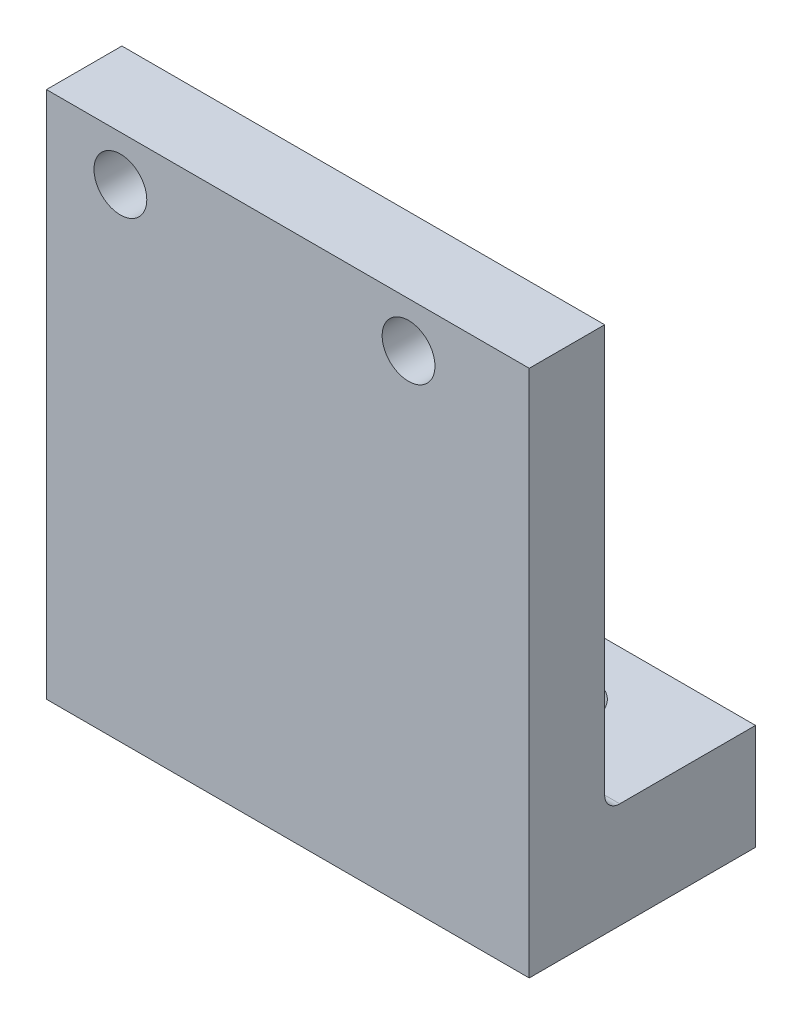
ISO-10303-21;
HEADER;
FILE_DESCRIPTION(('STEP AP214'),'2;1');
FILE_NAME('part.step','',(''),(''),'','','');
FILE_SCHEMA(('AUTOMOTIVE_DESIGN { 1 0 10303 214 1 1 1 1 }'));
ENDSEC;
DATA;
#1=APPLICATION_CONTEXT('core data for automotive mechanical design processes');
#2=APPLICATION_PROTOCOL_DEFINITION('international standard','automotive_design',2000,#1);
#3=PRODUCT_CONTEXT('',#1,'mechanical');
#4=PRODUCT('Part','Part','',(#3));
#5=PRODUCT_RELATED_PRODUCT_CATEGORY('part','',(#4));
#6=PRODUCT_DEFINITION_FORMATION('','',#4);
#7=PRODUCT_DEFINITION_CONTEXT('part definition',#1,'design');
#8=PRODUCT_DEFINITION('design','',#6,#7);
#9=PRODUCT_DEFINITION_SHAPE('','',#8);
#10=(LENGTH_UNIT() NAMED_UNIT(*) SI_UNIT(.MILLI.,.METRE.));
#11=(NAMED_UNIT(*) PLANE_ANGLE_UNIT() SI_UNIT($,.RADIAN.));
#12=(NAMED_UNIT(*) SI_UNIT($,.STERADIAN.) SOLID_ANGLE_UNIT());
#13=UNCERTAINTY_MEASURE_WITH_UNIT(LENGTH_MEASURE(1.E-05),#10,'distance_accuracy_value','');
#14=(GEOMETRIC_REPRESENTATION_CONTEXT(3) GLOBAL_UNCERTAINTY_ASSIGNED_CONTEXT((#13)) GLOBAL_UNIT_ASSIGNED_CONTEXT((#10,
#11,#12)) REPRESENTATION_CONTEXT('',''));
#15=CARTESIAN_POINT('',(0.,0.,0.));
#16=DIRECTION('',(0.,0.,1.));
#17=DIRECTION('',(1.,0.,0.));
#18=AXIS2_PLACEMENT_3D('',#15,#16,#17);
#19=CARTESIAN_POINT('',(0.,0.,0.));
#20=DIRECTION('',(0.,0.,1.));
#21=DIRECTION('',(1.,0.,0.));
#22=AXIS2_PLACEMENT_3D('',#19,#20,#21);
#23=PLANE('',#22);
#24=CARTESIAN_POINT('',(-11.1,7.,0.));
#25=DIRECTION('',(0.,0.,1.));
#26=DIRECTION('',(1.,0.,0.));
#27=AXIS2_PLACEMENT_3D('',#24,#25,#26);
#28=CIRCLE('',#27,1.75);
#29=CARTESIAN_POINT('',(-9.35,7.,0.));
#30=VERTEX_POINT('',#29);
#31=EDGE_CURVE('E116',#30,#30,#28,.T.);
#32=ORIENTED_EDGE('',*,*,#31,.T.);
#33=EDGE_LOOP('',(#32));
#34=FACE_BOUND('',#33,.T.);
#35=CARTESIAN_POINT('',(8.,7.,0.));
#36=DIRECTION('',(0.,0.,1.));
#37=DIRECTION('',(1.,0.,0.));
#38=AXIS2_PLACEMENT_3D('',#35,#36,#37);
#39=CIRCLE('',#38,1.75);
#40=CARTESIAN_POINT('',(9.75,7.,0.));
#41=VERTEX_POINT('',#40);
#42=EDGE_CURVE('E120',#41,#41,#39,.T.);
#43=ORIENTED_EDGE('',*,*,#42,.T.);
#44=EDGE_LOOP('',(#43));
#45=FACE_BOUND('',#44,.T.);
#46=DIRECTION('',(0.,1.,0.));
#47=VECTOR('',#46,1.);
#48=CARTESIAN_POINT('',(16.,10.,0.));
#49=LINE('',#48,#47);
#50=CARTESIAN_POINT('',(16.,-17.,0.));
#51=VERTEX_POINT('',#50);
#52=CARTESIAN_POINT('',(16.,10.,0.));
#53=VERTEX_POINT('',#52);
#54=EDGE_CURVE('E126',#51,#53,#49,.T.);
#55=ORIENTED_EDGE('',*,*,#54,.F.);
#56=DIRECTION('',(1.,0.,0.));
#57=VECTOR('',#56,1.);
#58=CARTESIAN_POINT('',(-16.,-17.,0.));
#59=LINE('',#58,#57);
#60=CARTESIAN_POINT('',(-16.,-17.,0.));
#61=VERTEX_POINT('',#60);
#62=EDGE_CURVE('E38',#51,#61,#59,.F.);
#63=ORIENTED_EDGE('',*,*,#62,.T.);
#64=DIRECTION('',(0.,-1.,0.));
#65=VECTOR('',#64,1.);
#66=CARTESIAN_POINT('',(-16.,10.,0.));
#67=LINE('',#66,#65);
#68=CARTESIAN_POINT('',(-16.,10.,0.));
#69=VERTEX_POINT('',#68);
#70=EDGE_CURVE('E131',#69,#61,#67,.T.);
#71=ORIENTED_EDGE('',*,*,#70,.F.);
#72=DIRECTION('',(-1.,0.,0.));
#73=VECTOR('',#72,1.);
#74=CARTESIAN_POINT('',(16.,10.,0.));
#75=LINE('',#74,#73);
#76=EDGE_CURVE('E137',#53,#69,#75,.T.);
#77=ORIENTED_EDGE('',*,*,#76,.F.);
#78=EDGE_LOOP('',(#55,#63,#71,#77));
#79=FACE_BOUND('',#78,.T.);
#80=ADVANCED_FACE('F17',(#34,#45,#79),#23,.F.);
#81=CARTESIAN_POINT('',(0.,0.,5.));
#82=DIRECTION('',(0.,0.,1.));
#83=DIRECTION('',(1.,0.,0.));
#84=AXIS2_PLACEMENT_3D('',#81,#82,#83);
#85=PLANE('',#84);
#86=CARTESIAN_POINT('',(8.,7.,5.));
#87=DIRECTION('',(0.,0.,1.));
#88=DIRECTION('',(1.,0.,0.));
#89=AXIS2_PLACEMENT_3D('',#86,#87,#88);
#90=CIRCLE('',#89,1.75);
#91=CARTESIAN_POINT('',(9.75,7.,5.));
#92=VERTEX_POINT('',#91);
#93=EDGE_CURVE('E123',#92,#92,#90,.T.);
#94=ORIENTED_EDGE('',*,*,#93,.F.);
#95=EDGE_LOOP('',(#94));
#96=FACE_BOUND('',#95,.T.);
#97=DIRECTION('',(0.,1.,0.));
#98=VECTOR('',#97,1.);
#99=CARTESIAN_POINT('',(16.,10.,5.));
#100=LINE('',#99,#98);
#101=CARTESIAN_POINT('',(16.,-25.,5.));
#102=VERTEX_POINT('',#101);
#103=CARTESIAN_POINT('',(16.,10.,5.));
#104=VERTEX_POINT('',#103);
#105=EDGE_CURVE('E82',#102,#104,#100,.T.);
#106=ORIENTED_EDGE('',*,*,#105,.T.);
#107=DIRECTION('',(-1.,0.,0.));
#108=VECTOR('',#107,1.);
#109=CARTESIAN_POINT('',(16.,10.,5.));
#110=LINE('',#109,#108);
#111=CARTESIAN_POINT('',(-16.,10.,5.));
#112=VERTEX_POINT('',#111);
#113=EDGE_CURVE('E130',#104,#112,#110,.T.);
#114=ORIENTED_EDGE('',*,*,#113,.T.);
#115=DIRECTION('',(0.,-1.,0.));
#116=VECTOR('',#115,1.);
#117=CARTESIAN_POINT('',(-16.,10.,5.));
#118=LINE('',#117,#116);
#119=CARTESIAN_POINT('',(-16.,-25.,5.));
#120=VERTEX_POINT('',#119);
#121=EDGE_CURVE('E133',#112,#120,#118,.T.);
#122=ORIENTED_EDGE('',*,*,#121,.T.);
#123=DIRECTION('',(1.,0.,0.));
#124=VECTOR('',#123,1.);
#125=CARTESIAN_POINT('',(-16.,-25.,5.));
#126=LINE('',#125,#124);
#127=EDGE_CURVE('E86',#120,#102,#126,.T.);
#128=ORIENTED_EDGE('',*,*,#127,.T.);
#129=EDGE_LOOP('',(#106,#114,#122,#128));
#130=FACE_BOUND('',#129,.T.);
#131=CARTESIAN_POINT('',(-11.1,7.,5.));
#132=DIRECTION('',(0.,0.,1.));
#133=DIRECTION('',(1.,0.,0.));
#134=AXIS2_PLACEMENT_3D('',#131,#132,#133);
#135=CIRCLE('',#134,1.75);
#136=CARTESIAN_POINT('',(-9.35,7.,5.));
#137=VERTEX_POINT('',#136);
#138=EDGE_CURVE('E117',#137,#137,#135,.T.);
#139=ORIENTED_EDGE('',*,*,#138,.F.);
#140=EDGE_LOOP('',(#139));
#141=FACE_BOUND('',#140,.T.);
#142=ADVANCED_FACE('F164',(#96,#130,#141),#85,.T.);
#143=CARTESIAN_POINT('',(16.,10.,5.));
#144=DIRECTION('',(-1.,0.,0.));
#145=DIRECTION('',(0.,-1.,0.));
#146=AXIS2_PLACEMENT_3D('',#143,#144,#145);
#147=PLANE('',#146);
#148=DIRECTION('',(0.,0.,-1.));
#149=VECTOR('',#148,1.);
#150=CARTESIAN_POINT('',(16.,-25.,5.));
#151=LINE('',#150,#149);
#152=CARTESIAN_POINT('',(16.,-25.,-10.));
#153=VERTEX_POINT('',#152);
#154=EDGE_CURVE('E75',#102,#153,#151,.T.);
#155=ORIENTED_EDGE('',*,*,#154,.T.);
#156=DIRECTION('',(0.,-1.,0.));
#157=VECTOR('',#156,1.);
#158=CARTESIAN_POINT('',(16.,-25.,-10.));
#159=LINE('',#158,#157);
#160=CARTESIAN_POINT('',(16.,-18.,-10.));
#161=VERTEX_POINT('',#160);
#162=EDGE_CURVE('E79',#161,#153,#159,.T.);
#163=ORIENTED_EDGE('',*,*,#162,.F.);
#164=DIRECTION('',(0.,0.,1.));
#165=VECTOR('',#164,1.);
#166=CARTESIAN_POINT('',(16.,-18.,-10.));
#167=LINE('',#166,#165);
#168=CARTESIAN_POINT('',(16.,-18.,-1.));
#169=VERTEX_POINT('',#168);
#170=EDGE_CURVE('E111',#161,#169,#167,.T.);
#171=ORIENTED_EDGE('',*,*,#170,.T.);
#172=CARTESIAN_POINT('',(16.,-17.,-1.));
#173=DIRECTION('',(-1.,0.,0.));
#174=DIRECTION('',(0.,-1.,0.));
#175=AXIS2_PLACEMENT_3D('',#172,#173,#174);
#176=CIRCLE('',#175,1.);
#177=EDGE_CURVE('E25',#169,#51,#176,.T.);
#178=ORIENTED_EDGE('',*,*,#177,.T.);
#179=ORIENTED_EDGE('',*,*,#54,.T.);
#180=DIRECTION('',(0.,0.,-1.));
#181=VECTOR('',#180,1.);
#182=CARTESIAN_POINT('',(16.,10.,5.));
#183=LINE('',#182,#181);
#184=EDGE_CURVE('E144',#104,#53,#183,.T.);
#185=ORIENTED_EDGE('',*,*,#184,.F.);
#186=ORIENTED_EDGE('',*,*,#105,.F.);
#187=EDGE_LOOP('',(#155,#163,#171,#178,#179,#185,#186));
#188=FACE_BOUND('',#187,.T.);
#189=ADVANCED_FACE('F77',(#188),#147,.F.);
#190=CARTESIAN_POINT('',(16.,10.,5.));
#191=DIRECTION('',(0.,-1.,0.));
#192=DIRECTION('',(1.,0.,0.));
#193=AXIS2_PLACEMENT_3D('',#190,#191,#192);
#194=PLANE('',#193);
#195=ORIENTED_EDGE('',*,*,#76,.T.);
#196=DIRECTION('',(0.,0.,-1.));
#197=VECTOR('',#196,1.);
#198=CARTESIAN_POINT('',(-16.,10.,5.));
#199=LINE('',#198,#197);
#200=EDGE_CURVE('E141',#112,#69,#199,.T.);
#201=ORIENTED_EDGE('',*,*,#200,.F.);
#202=ORIENTED_EDGE('',*,*,#113,.F.);
#203=ORIENTED_EDGE('',*,*,#184,.T.);
#204=EDGE_LOOP('',(#195,#201,#202,#203));
#205=FACE_BOUND('',#204,.T.);
#206=ADVANCED_FACE('F162',(#205),#194,.F.);
#207=CARTESIAN_POINT('',(-16.,10.,5.));
#208=DIRECTION('',(1.,0.,0.));
#209=DIRECTION('',(0.,0.,-1.));
#210=AXIS2_PLACEMENT_3D('',#207,#208,#209);
#211=PLANE('',#210);
#212=ORIENTED_EDGE('',*,*,#70,.T.);
#213=CARTESIAN_POINT('',(-16.,-17.,-1.));
#214=DIRECTION('',(1.,0.,0.));
#215=DIRECTION('',(0.,0.,-1.));
#216=AXIS2_PLACEMENT_3D('',#213,#214,#215);
#217=CIRCLE('',#216,1.);
#218=CARTESIAN_POINT('',(-16.,-18.,-1.));
#219=VERTEX_POINT('',#218);
#220=EDGE_CURVE('E11',#61,#219,#217,.T.);
#221=ORIENTED_EDGE('',*,*,#220,.T.);
#222=DIRECTION('',(0.,0.,1.));
#223=VECTOR('',#222,1.);
#224=CARTESIAN_POINT('',(-16.,-18.,-10.));
#225=LINE('',#224,#223);
#226=CARTESIAN_POINT('',(-16.,-18.,-10.));
#227=VERTEX_POINT('',#226);
#228=EDGE_CURVE('E113',#227,#219,#225,.T.);
#229=ORIENTED_EDGE('',*,*,#228,.F.);
#230=DIRECTION('',(0.,1.,0.));
#231=VECTOR('',#230,1.);
#232=CARTESIAN_POINT('',(-16.,-25.,-10.));
#233=LINE('',#232,#231);
#234=CARTESIAN_POINT('',(-16.,-25.,-10.));
#235=VERTEX_POINT('',#234);
#236=EDGE_CURVE('E94',#235,#227,#233,.T.);
#237=ORIENTED_EDGE('',*,*,#236,.F.);
#238=DIRECTION('',(0.,0.,-1.));
#239=VECTOR('',#238,1.);
#240=CARTESIAN_POINT('',(-16.,-25.,5.));
#241=LINE('',#240,#239);
#242=EDGE_CURVE('E85',#120,#235,#241,.T.);
#243=ORIENTED_EDGE('',*,*,#242,.F.);
#244=ORIENTED_EDGE('',*,*,#121,.F.);
#245=ORIENTED_EDGE('',*,*,#200,.T.);
#246=EDGE_LOOP('',(#212,#221,#229,#237,#243,#244,#245));
#247=FACE_BOUND('',#246,.T.);
#248=ADVANCED_FACE('F157',(#247),#211,.F.);
#249=CARTESIAN_POINT('',(-16.,-25.,5.));
#250=DIRECTION('',(0.,1.,0.));
#251=DIRECTION('',(0.,0.,1.));
#252=AXIS2_PLACEMENT_3D('',#249,#250,#251);
#253=PLANE('',#252);
#254=CARTESIAN_POINT('',(-8.,-25.,-5.));
#255=DIRECTION('',(0.,1.,0.));
#256=DIRECTION('',(-1.,0.,0.));
#257=AXIS2_PLACEMENT_3D('',#254,#255,#256);
#258=CIRCLE('',#257,2.25);
#259=CARTESIAN_POINT('',(-10.25,-25.,-5.));
#260=VERTEX_POINT('',#259);
#261=EDGE_CURVE('E100',#260,#260,#258,.T.);
#262=ORIENTED_EDGE('',*,*,#261,.T.);
#263=EDGE_LOOP('',(#262));
#264=FACE_BOUND('',#263,.T.);
#265=CARTESIAN_POINT('',(8.,-25.,-5.));
#266=DIRECTION('',(0.,1.,0.));
#267=DIRECTION('',(-1.,0.,0.));
#268=AXIS2_PLACEMENT_3D('',#265,#266,#267);
#269=CIRCLE('',#268,2.25);
#270=CARTESIAN_POINT('',(5.75,-25.,-5.));
#271=VERTEX_POINT('',#270);
#272=EDGE_CURVE('E288',#271,#271,#269,.T.);
#273=ORIENTED_EDGE('',*,*,#272,.T.);
#274=EDGE_LOOP('',(#273));
#275=FACE_BOUND('',#274,.T.);
#276=ORIENTED_EDGE('',*,*,#242,.T.);
#277=DIRECTION('',(-1.,0.,0.));
#278=VECTOR('',#277,1.);
#279=CARTESIAN_POINT('',(16.,-25.,-10.));
#280=LINE('',#279,#278);
#281=EDGE_CURVE('E89',#153,#235,#280,.T.);
#282=ORIENTED_EDGE('',*,*,#281,.F.);
#283=ORIENTED_EDGE('',*,*,#154,.F.);
#284=ORIENTED_EDGE('',*,*,#127,.F.);
#285=EDGE_LOOP('',(#276,#282,#283,#284));
#286=FACE_BOUND('',#285,.T.);
#287=ADVANCED_FACE('F90',(#264,#275,#286),#253,.F.);
#288=CARTESIAN_POINT('',(8.,7.,5.));
#289=DIRECTION('',(0.,0.,-1.));
#290=DIRECTION('',(-1.,0.,0.));
#291=AXIS2_PLACEMENT_3D('',#288,#289,#290);
#292=CYLINDRICAL_SURFACE('',#291,1.75);
#293=ORIENTED_EDGE('',*,*,#93,.T.);
#294=EDGE_LOOP('',(#293));
#295=FACE_BOUND('',#294,.T.);
#296=ORIENTED_EDGE('',*,*,#42,.F.);
#297=EDGE_LOOP('',(#296));
#298=FACE_BOUND('',#297,.T.);
#299=ADVANCED_FACE('F174',(#295,#298),#292,.F.);
#300=CARTESIAN_POINT('',(-11.1,7.,5.));
#301=DIRECTION('',(0.,0.,-1.));
#302=DIRECTION('',(-1.,0.,0.));
#303=AXIS2_PLACEMENT_3D('',#300,#301,#302);
#304=CYLINDRICAL_SURFACE('',#303,1.75);
#305=ORIENTED_EDGE('',*,*,#138,.T.);
#306=EDGE_LOOP('',(#305));
#307=FACE_BOUND('',#306,.T.);
#308=ORIENTED_EDGE('',*,*,#31,.F.);
#309=EDGE_LOOP('',(#308));
#310=FACE_BOUND('',#309,.T.);
#311=ADVANCED_FACE('F171',(#307,#310),#304,.F.);
#312=CARTESIAN_POINT('',(16.,-18.,-10.));
#313=DIRECTION('',(0.,-1.,0.));
#314=DIRECTION('',(0.,0.,-1.));
#315=AXIS2_PLACEMENT_3D('',#312,#313,#314);
#316=PLANE('',#315);
#317=CARTESIAN_POINT('',(-8.,-18.,-5.));
#318=DIRECTION('',(0.,1.,0.));
#319=DIRECTION('',(-1.,0.,0.));
#320=AXIS2_PLACEMENT_3D('',#317,#318,#319);
#321=CIRCLE('',#320,2.25);
#322=CARTESIAN_POINT('',(-10.25,-18.,-5.));
#323=VERTEX_POINT('',#322);
#324=EDGE_CURVE('E103',#323,#323,#321,.T.);
#325=ORIENTED_EDGE('',*,*,#324,.F.);
#326=EDGE_LOOP('',(#325));
#327=FACE_BOUND('',#326,.T.);
#328=CARTESIAN_POINT('',(8.,-18.,-5.));
#329=DIRECTION('',(0.,1.,0.));
#330=DIRECTION('',(-1.,0.,0.));
#331=AXIS2_PLACEMENT_3D('',#328,#329,#330);
#332=CIRCLE('',#331,2.25);
#333=CARTESIAN_POINT('',(5.75,-18.,-5.));
#334=VERTEX_POINT('',#333);
#335=EDGE_CURVE('E106',#334,#334,#332,.T.);
#336=ORIENTED_EDGE('',*,*,#335,.F.);
#337=EDGE_LOOP('',(#336));
#338=FACE_BOUND('',#337,.T.);
#339=ORIENTED_EDGE('',*,*,#228,.T.);
#340=DIRECTION('',(1.,0.,0.));
#341=VECTOR('',#340,1.);
#342=CARTESIAN_POINT('',(16.,-18.,-1.));
#343=LINE('',#342,#341);
#344=EDGE_CURVE('E147',#219,#169,#343,.T.);
#345=ORIENTED_EDGE('',*,*,#344,.T.);
#346=ORIENTED_EDGE('',*,*,#170,.F.);
#347=DIRECTION('',(1.,0.,0.));
#348=VECTOR('',#347,1.);
#349=CARTESIAN_POINT('',(16.,-18.,-10.));
#350=LINE('',#349,#348);
#351=EDGE_CURVE('E98',#227,#161,#350,.T.);
#352=ORIENTED_EDGE('',*,*,#351,.F.);
#353=EDGE_LOOP('',(#339,#345,#346,#352));
#354=FACE_BOUND('',#353,.T.);
#355=ADVANCED_FACE('F152',(#327,#338,#354),#316,.F.);
#356=CARTESIAN_POINT('',(0.,0.,-10.));
#357=DIRECTION('',(0.,0.,1.));
#358=DIRECTION('',(1.,0.,0.));
#359=AXIS2_PLACEMENT_3D('',#356,#357,#358);
#360=PLANE('',#359);
#361=ORIENTED_EDGE('',*,*,#162,.T.);
#362=ORIENTED_EDGE('',*,*,#281,.T.);
#363=ORIENTED_EDGE('',*,*,#236,.T.);
#364=ORIENTED_EDGE('',*,*,#351,.T.);
#365=EDGE_LOOP('',(#361,#362,#363,#364));
#366=FACE_BOUND('',#365,.T.);
#367=ADVANCED_FACE('F96',(#366),#360,.F.);
#368=CARTESIAN_POINT('',(8.,-25.,-5.));
#369=DIRECTION('',(0.,1.,0.));
#370=DIRECTION('',(-1.,0.,0.));
#371=AXIS2_PLACEMENT_3D('',#368,#369,#370);
#372=CYLINDRICAL_SURFACE('',#371,2.25);
#373=ORIENTED_EDGE('',*,*,#272,.F.);
#374=EDGE_LOOP('',(#373));
#375=FACE_BOUND('',#374,.T.);
#376=ORIENTED_EDGE('',*,*,#335,.T.);
#377=EDGE_LOOP('',(#376));
#378=FACE_BOUND('',#377,.T.);
#379=ADVANCED_FACE('F253',(#375,#378),#372,.F.);
#380=CARTESIAN_POINT('',(-8.,-25.,-5.));
#381=DIRECTION('',(0.,1.,0.));
#382=DIRECTION('',(-1.,0.,0.));
#383=AXIS2_PLACEMENT_3D('',#380,#381,#382);
#384=CYLINDRICAL_SURFACE('',#383,2.25);
#385=ORIENTED_EDGE('',*,*,#261,.F.);
#386=EDGE_LOOP('',(#385));
#387=FACE_BOUND('',#386,.T.);
#388=ORIENTED_EDGE('',*,*,#324,.T.);
#389=EDGE_LOOP('',(#388));
#390=FACE_BOUND('',#389,.T.);
#391=ADVANCED_FACE('F262',(#387,#390),#384,.F.);
#392=CARTESIAN_POINT('',(16.,-17.,-1.));
#393=DIRECTION('',(-1.,0.,0.));
#394=DIRECTION('',(0.,0.,1.));
#395=AXIS2_PLACEMENT_3D('',#392,#393,#394);
#396=CYLINDRICAL_SURFACE('',#395,1.);
#397=ORIENTED_EDGE('',*,*,#220,.F.);
#398=ORIENTED_EDGE('',*,*,#62,.F.);
#399=ORIENTED_EDGE('',*,*,#177,.F.);
#400=ORIENTED_EDGE('',*,*,#344,.F.);
#401=EDGE_LOOP('',(#397,#398,#399,#400));
#402=FACE_BOUND('',#401,.T.);
#403=ADVANCED_FACE('F19',(#402),#396,.F.);
#404=CLOSED_SHELL('',(#80,#142,#189,#206,#248,#287,#299,#311,#355,#367,#379,#391,#403));
#405=MANIFOLD_SOLID_BREP('B1',#404);
#406=ADVANCED_BREP_SHAPE_REPRESENTATION('',(#18,#405),#14);
#407=SHAPE_DEFINITION_REPRESENTATION(#9,#406);
ENDSEC;
END-ISO-10303-21;
